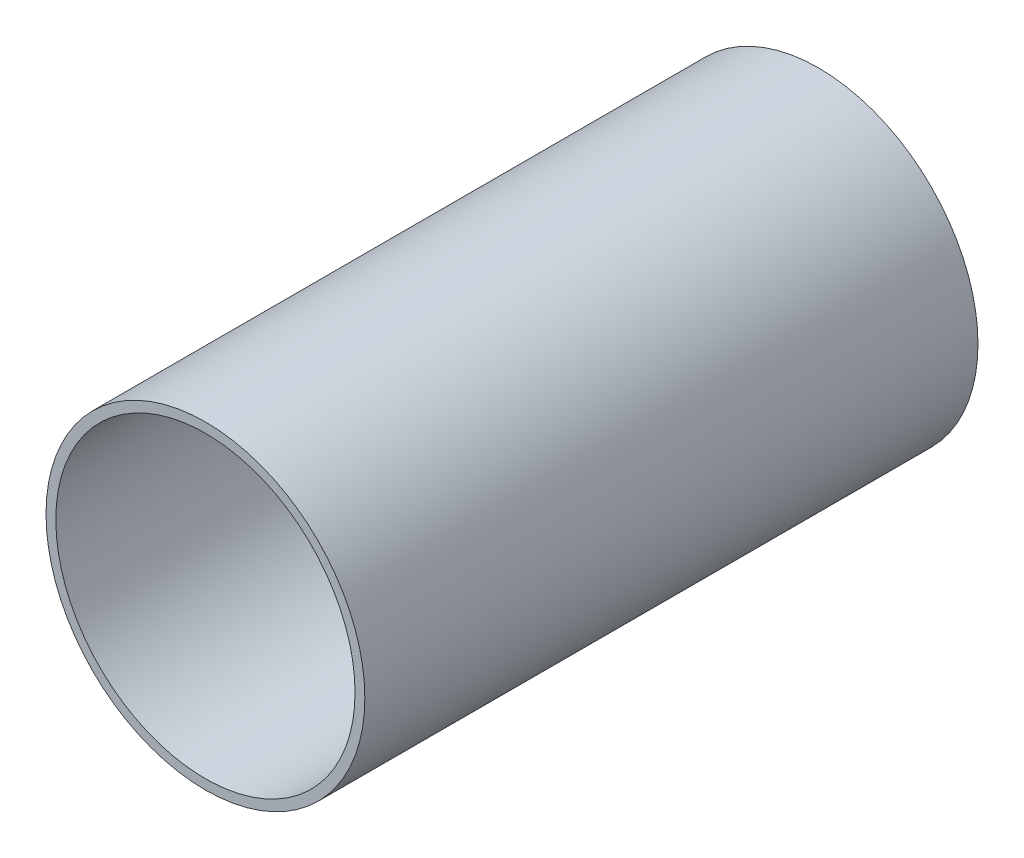
ISO-10303-21;
HEADER;
FILE_DESCRIPTION(('STEP AP214'),'2;1');
FILE_NAME('part.step','',(''),(''),'','','');
FILE_SCHEMA(('AUTOMOTIVE_DESIGN { 1 0 10303 214 1 1 1 1 }'));
ENDSEC;
DATA;
#1=APPLICATION_CONTEXT('core data for automotive mechanical design processes');
#2=APPLICATION_PROTOCOL_DEFINITION('international standard','automotive_design',2000,#1);
#3=PRODUCT_CONTEXT('',#1,'mechanical');
#4=PRODUCT('Part','Part','',(#3));
#5=PRODUCT_RELATED_PRODUCT_CATEGORY('part','',(#4));
#6=PRODUCT_DEFINITION_FORMATION('','',#4);
#7=PRODUCT_DEFINITION_CONTEXT('part definition',#1,'design');
#8=PRODUCT_DEFINITION('design','',#6,#7);
#9=PRODUCT_DEFINITION_SHAPE('','',#8);
#10=(LENGTH_UNIT() NAMED_UNIT(*) SI_UNIT(.MILLI.,.METRE.));
#11=(NAMED_UNIT(*) PLANE_ANGLE_UNIT() SI_UNIT($,.RADIAN.));
#12=(NAMED_UNIT(*) SI_UNIT($,.STERADIAN.) SOLID_ANGLE_UNIT());
#13=UNCERTAINTY_MEASURE_WITH_UNIT(LENGTH_MEASURE(1.E-05),#10,'distance_accuracy_value','');
#14=(GEOMETRIC_REPRESENTATION_CONTEXT(3) GLOBAL_UNCERTAINTY_ASSIGNED_CONTEXT((#13)) GLOBAL_UNIT_ASSIGNED_CONTEXT((#10,
#11,#12)) REPRESENTATION_CONTEXT('',''));
#15=CARTESIAN_POINT('',(0.,0.,0.));
#16=DIRECTION('',(0.,0.,1.));
#17=DIRECTION('',(1.,0.,0.));
#18=AXIS2_PLACEMENT_3D('',#15,#16,#17);
#19=CARTESIAN_POINT('',(0.,0.,250.));
#20=DIRECTION('',(0.,0.,1.));
#21=DIRECTION('',(1.,0.,0.));
#22=AXIS2_PLACEMENT_3D('',#19,#20,#21);
#23=PLANE('',#22);
#24=CARTESIAN_POINT('',(0.,0.,250.));
#25=DIRECTION('',(0.,0.,1.));
#26=DIRECTION('',(1.,0.,0.));
#27=AXIS2_PLACEMENT_3D('',#24,#25,#26);
#28=CIRCLE('',#27,65.);
#29=CARTESIAN_POINT('',(65.,0.,250.));
#30=VERTEX_POINT('',#29);
#31=EDGE_CURVE('E10',#30,#30,#28,.T.);
#32=ORIENTED_EDGE('',*,*,#31,.T.);
#33=EDGE_LOOP('',(#32));
#34=FACE_BOUND('',#33,.T.);
#35=CARTESIAN_POINT('',(0.,0.,250.));
#36=DIRECTION('',(0.,0.,1.));
#37=DIRECTION('',(1.,0.,0.));
#38=AXIS2_PLACEMENT_3D('',#35,#36,#37);
#39=CIRCLE('',#38,61.);
#40=CARTESIAN_POINT('',(61.,0.,250.));
#41=VERTEX_POINT('',#40);
#42=EDGE_CURVE('E52',#41,#41,#39,.T.);
#43=ORIENTED_EDGE('',*,*,#42,.F.);
#44=EDGE_LOOP('',(#43));
#45=FACE_BOUND('',#44,.T.);
#46=ADVANCED_FACE('F39',(#34,#45),#23,.T.);
#47=CARTESIAN_POINT('',(0.,0.,0.));
#48=DIRECTION('',(0.,0.,1.));
#49=DIRECTION('',(1.,0.,0.));
#50=AXIS2_PLACEMENT_3D('',#47,#48,#49);
#51=PLANE('',#50);
#52=CARTESIAN_POINT('',(0.,0.,0.));
#53=DIRECTION('',(0.,0.,1.));
#54=DIRECTION('',(1.,0.,0.));
#55=AXIS2_PLACEMENT_3D('',#52,#53,#54);
#56=CIRCLE('',#55,65.);
#57=CARTESIAN_POINT('',(65.,0.,0.));
#58=VERTEX_POINT('',#57);
#59=EDGE_CURVE('E43',#58,#58,#56,.T.);
#60=ORIENTED_EDGE('',*,*,#59,.F.);
#61=EDGE_LOOP('',(#60));
#62=FACE_BOUND('',#61,.T.);
#63=CARTESIAN_POINT('',(0.,0.,0.));
#64=DIRECTION('',(0.,0.,1.));
#65=DIRECTION('',(1.,0.,0.));
#66=AXIS2_PLACEMENT_3D('',#63,#64,#65);
#67=CIRCLE('',#66,61.);
#68=CARTESIAN_POINT('',(61.,0.,0.));
#69=VERTEX_POINT('',#68);
#70=EDGE_CURVE('E54',#69,#69,#67,.T.);
#71=ORIENTED_EDGE('',*,*,#70,.T.);
#72=EDGE_LOOP('',(#71));
#73=FACE_BOUND('',#72,.T.);
#74=ADVANCED_FACE('F66',(#62,#73),#51,.F.);
#75=CARTESIAN_POINT('',(0.,0.,250.));
#76=DIRECTION('',(0.,0.,-1.));
#77=DIRECTION('',(-1.,0.,0.));
#78=AXIS2_PLACEMENT_3D('',#75,#76,#77);
#79=CYLINDRICAL_SURFACE('',#78,65.);
#80=ORIENTED_EDGE('',*,*,#31,.F.);
#81=EDGE_LOOP('',(#80));
#82=FACE_BOUND('',#81,.T.);
#83=ORIENTED_EDGE('',*,*,#59,.T.);
#84=EDGE_LOOP('',(#83));
#85=FACE_BOUND('',#84,.T.);
#86=ADVANCED_FACE('F41',(#82,#85),#79,.T.);
#87=CARTESIAN_POINT('',(0.,0.,250.));
#88=DIRECTION('',(0.,0.,-1.));
#89=DIRECTION('',(-1.,0.,0.));
#90=AXIS2_PLACEMENT_3D('',#87,#88,#89);
#91=CYLINDRICAL_SURFACE('',#90,61.);
#92=ORIENTED_EDGE('',*,*,#42,.T.);
#93=EDGE_LOOP('',(#92));
#94=FACE_BOUND('',#93,.T.);
#95=ORIENTED_EDGE('',*,*,#70,.F.);
#96=EDGE_LOOP('',(#95));
#97=FACE_BOUND('',#96,.T.);
#98=ADVANCED_FACE('F62',(#94,#97),#91,.F.);
#99=CLOSED_SHELL('',(#46,#74,#86,#98));
#100=MANIFOLD_SOLID_BREP('B2',#99);
#101=ADVANCED_BREP_SHAPE_REPRESENTATION('',(#18,#100),#14);
#102=SHAPE_DEFINITION_REPRESENTATION(#9,#101);
ENDSEC;
END-ISO-10303-21;
